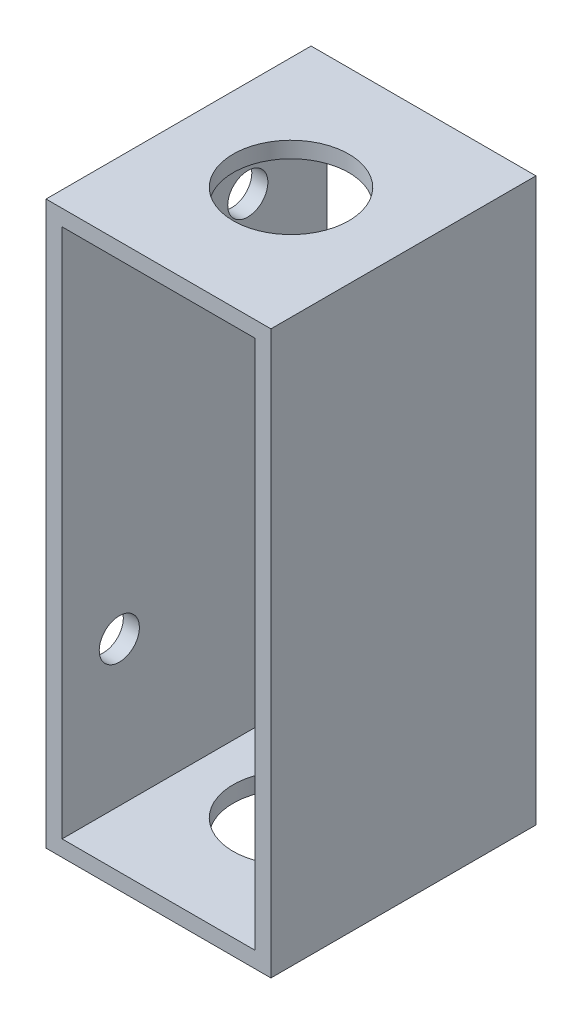
ISO-10303-21;
HEADER;
FILE_DESCRIPTION(('STEP AP214'),'2;1');
FILE_NAME('part.step','',(''),(''),'','','');
FILE_SCHEMA(('AUTOMOTIVE_DESIGN { 1 0 10303 214 1 1 1 1 }'));
ENDSEC;
DATA;
#1=APPLICATION_CONTEXT('core data for automotive mechanical design processes');
#2=APPLICATION_PROTOCOL_DEFINITION('international standard','automotive_design',2000,#1);
#3=PRODUCT_CONTEXT('',#1,'mechanical');
#4=PRODUCT('Part','Part','',(#3));
#5=PRODUCT_RELATED_PRODUCT_CATEGORY('part','',(#4));
#6=PRODUCT_DEFINITION_FORMATION('','',#4);
#7=PRODUCT_DEFINITION_CONTEXT('part definition',#1,'design');
#8=PRODUCT_DEFINITION('design','',#6,#7);
#9=PRODUCT_DEFINITION_SHAPE('','',#8);
#10=(LENGTH_UNIT() NAMED_UNIT(*) SI_UNIT(.MILLI.,.METRE.));
#11=(NAMED_UNIT(*) PLANE_ANGLE_UNIT() SI_UNIT($,.RADIAN.));
#12=(NAMED_UNIT(*) SI_UNIT($,.STERADIAN.) SOLID_ANGLE_UNIT());
#13=UNCERTAINTY_MEASURE_WITH_UNIT(LENGTH_MEASURE(1.E-05),#10,'distance_accuracy_value','');
#14=(GEOMETRIC_REPRESENTATION_CONTEXT(3) GLOBAL_UNCERTAINTY_ASSIGNED_CONTEXT((#13)) GLOBAL_UNIT_ASSIGNED_CONTEXT((#10,
#11,#12)) REPRESENTATION_CONTEXT('',''));
#15=CARTESIAN_POINT('',(0.,0.,0.));
#16=DIRECTION('',(0.,0.,1.));
#17=DIRECTION('',(1.,0.,0.));
#18=AXIS2_PLACEMENT_3D('',#15,#16,#17);
#19=CARTESIAN_POINT('',(0.,-5.,16.5));
#20=DIRECTION('',(1.,0.,0.));
#21=DIRECTION('',(0.,1.,0.));
#22=AXIS2_PLACEMENT_3D('',#19,#20,#21);
#23=PLANE('',#22);
#24=CARTESIAN_POINT('',(0.,25.,4.93966677797175));
#25=DIRECTION('',(1.,0.,0.));
#26=DIRECTION('',(0.,0.,-1.));
#27=AXIS2_PLACEMENT_3D('',#24,#25,#26);
#28=CIRCLE('',#27,1.25);
#29=CARTESIAN_POINT('',(0.,25.,3.68966677797175));
#30=VERTEX_POINT('',#29);
#31=EDGE_CURVE('E222',#30,#30,#28,.T.);
#32=ORIENTED_EDGE('',*,*,#31,.T.);
#33=EDGE_LOOP('',(#32));
#34=FACE_BOUND('',#33,.T.);
#35=CARTESIAN_POINT('',(0.,5.,12.9396667779718));
#36=DIRECTION('',(1.,0.,0.));
#37=DIRECTION('',(0.,0.,-1.));
#38=AXIS2_PLACEMENT_3D('',#35,#36,#37);
#39=CIRCLE('',#38,1.25);
#40=CARTESIAN_POINT('',(0.,5.,11.6896667779718));
#41=VERTEX_POINT('',#40);
#42=EDGE_CURVE('E218',#41,#41,#39,.T.);
#43=ORIENTED_EDGE('',*,*,#42,.T.);
#44=EDGE_LOOP('',(#43));
#45=FACE_BOUND('',#44,.T.);
#46=DIRECTION('',(0.,-1.,0.));
#47=VECTOR('',#46,1.);
#48=CARTESIAN_POINT('',(0.,-5.,0.));
#49=LINE('',#48,#47);
#50=CARTESIAN_POINT('',(0.,30.,0.));
#51=VERTEX_POINT('',#50);
#52=CARTESIAN_POINT('',(0.,-5.,0.));
#53=VERTEX_POINT('',#52);
#54=EDGE_CURVE('E142',#51,#53,#49,.T.);
#55=ORIENTED_EDGE('',*,*,#54,.T.);
#56=DIRECTION('',(0.,0.,-1.));
#57=VECTOR('',#56,1.);
#58=CARTESIAN_POINT('',(0.,-5.,16.5));
#59=LINE('',#58,#57);
#60=CARTESIAN_POINT('',(0.,-5.,16.5));
#61=VERTEX_POINT('',#60);
#62=EDGE_CURVE('E184',#61,#53,#59,.T.);
#63=ORIENTED_EDGE('',*,*,#62,.F.);
#64=DIRECTION('',(0.,-1.,0.));
#65=VECTOR('',#64,1.);
#66=CARTESIAN_POINT('',(0.,-5.,16.5));
#67=LINE('',#66,#65);
#68=CARTESIAN_POINT('',(0.,30.,16.5));
#69=VERTEX_POINT('',#68);
#70=EDGE_CURVE('E147',#69,#61,#67,.T.);
#71=ORIENTED_EDGE('',*,*,#70,.F.);
#72=DIRECTION('',(0.,0.,-1.));
#73=VECTOR('',#72,1.);
#74=CARTESIAN_POINT('',(0.,30.,16.5));
#75=LINE('',#74,#73);
#76=EDGE_CURVE('E161',#69,#51,#75,.T.);
#77=ORIENTED_EDGE('',*,*,#76,.T.);
#78=EDGE_LOOP('',(#55,#63,#71,#77));
#79=FACE_BOUND('',#78,.T.);
#80=ADVANCED_FACE('F46',(#34,#45,#79),#23,.F.);
#81=CARTESIAN_POINT('',(0.,-5.,16.5));
#82=DIRECTION('',(0.,1.,0.));
#83=DIRECTION('',(0.,0.,1.));
#84=AXIS2_PLACEMENT_3D('',#81,#82,#83);
#85=PLANE('',#84);
#86=CARTESIAN_POINT('',(7.,-5.,8.25));
#87=DIRECTION('',(0.,1.,0.));
#88=DIRECTION('',(0.,0.,1.));
#89=AXIS2_PLACEMENT_3D('',#86,#87,#88);
#90=CIRCLE('',#89,3.6);
#91=CARTESIAN_POINT('',(7.,-5.,11.85));
#92=VERTEX_POINT('',#91);
#93=EDGE_CURVE('E204',#92,#92,#90,.F.);
#94=ORIENTED_EDGE('',*,*,#93,.F.);
#95=EDGE_LOOP('',(#94));
#96=FACE_BOUND('',#95,.T.);
#97=DIRECTION('',(1.,0.,0.));
#98=VECTOR('',#97,1.);
#99=CARTESIAN_POINT('',(0.,-5.,0.));
#100=LINE('',#99,#98);
#101=CARTESIAN_POINT('',(14.,-5.,0.));
#102=VERTEX_POINT('',#101);
#103=EDGE_CURVE('E165',#53,#102,#100,.T.);
#104=ORIENTED_EDGE('',*,*,#103,.T.);
#105=DIRECTION('',(0.,0.,-1.));
#106=VECTOR('',#105,1.);
#107=CARTESIAN_POINT('',(14.,-5.,16.5));
#108=LINE('',#107,#106);
#109=CARTESIAN_POINT('',(14.,-5.,16.5));
#110=VERTEX_POINT('',#109);
#111=EDGE_CURVE('E180',#110,#102,#108,.T.);
#112=ORIENTED_EDGE('',*,*,#111,.F.);
#113=DIRECTION('',(1.,0.,0.));
#114=VECTOR('',#113,1.);
#115=CARTESIAN_POINT('',(0.,-5.,16.5));
#116=LINE('',#115,#114);
#117=EDGE_CURVE('E151',#61,#110,#116,.T.);
#118=ORIENTED_EDGE('',*,*,#117,.F.);
#119=ORIENTED_EDGE('',*,*,#62,.T.);
#120=EDGE_LOOP('',(#104,#112,#118,#119));
#121=FACE_BOUND('',#120,.T.);
#122=ADVANCED_FACE('F249',(#96,#121),#85,.F.);
#123=CARTESIAN_POINT('',(14.,-5.,16.5));
#124=DIRECTION('',(-1.,0.,0.));
#125=DIRECTION('',(0.,0.,1.));
#126=AXIS2_PLACEMENT_3D('',#123,#124,#125);
#127=PLANE('',#126);
#128=DIRECTION('',(0.,1.,0.));
#129=VECTOR('',#128,1.);
#130=CARTESIAN_POINT('',(14.,-5.,0.));
#131=LINE('',#130,#129);
#132=CARTESIAN_POINT('',(14.,30.,0.));
#133=VERTEX_POINT('',#132);
#134=EDGE_CURVE('E168',#102,#133,#131,.T.);
#135=ORIENTED_EDGE('',*,*,#134,.T.);
#136=DIRECTION('',(0.,0.,-1.));
#137=VECTOR('',#136,1.);
#138=CARTESIAN_POINT('',(14.,30.,16.5));
#139=LINE('',#138,#137);
#140=CARTESIAN_POINT('',(14.,30.,16.5));
#141=VERTEX_POINT('',#140);
#142=EDGE_CURVE('E176',#141,#133,#139,.T.);
#143=ORIENTED_EDGE('',*,*,#142,.F.);
#144=DIRECTION('',(0.,1.,0.));
#145=VECTOR('',#144,1.);
#146=CARTESIAN_POINT('',(14.,-5.,16.5));
#147=LINE('',#146,#145);
#148=EDGE_CURVE('E155',#110,#141,#147,.T.);
#149=ORIENTED_EDGE('',*,*,#148,.F.);
#150=ORIENTED_EDGE('',*,*,#111,.T.);
#151=EDGE_LOOP('',(#135,#143,#149,#150));
#152=FACE_BOUND('',#151,.T.);
#153=ADVANCED_FACE('F255',(#152),#127,.F.);
#154=CARTESIAN_POINT('',(0.,30.,16.5));
#155=DIRECTION('',(0.,-1.,0.));
#156=DIRECTION('',(0.,0.,-1.));
#157=AXIS2_PLACEMENT_3D('',#154,#155,#156);
#158=PLANE('',#157);
#159=CARTESIAN_POINT('',(7.,30.,8.25));
#160=DIRECTION('',(0.,1.,0.));
#161=DIRECTION('',(0.,0.,1.));
#162=AXIS2_PLACEMENT_3D('',#159,#160,#161);
#163=CIRCLE('',#162,3.6);
#164=CARTESIAN_POINT('',(7.,30.,11.85));
#165=VERTEX_POINT('',#164);
#166=EDGE_CURVE('E213',#165,#165,#163,.T.);
#167=ORIENTED_EDGE('',*,*,#166,.F.);
#168=EDGE_LOOP('',(#167));
#169=FACE_BOUND('',#168,.T.);
#170=DIRECTION('',(-1.,0.,0.));
#171=VECTOR('',#170,1.);
#172=CARTESIAN_POINT('',(0.,30.,0.));
#173=LINE('',#172,#171);
#174=EDGE_CURVE('E152',#133,#51,#173,.T.);
#175=ORIENTED_EDGE('',*,*,#174,.T.);
#176=ORIENTED_EDGE('',*,*,#76,.F.);
#177=DIRECTION('',(-1.,0.,0.));
#178=VECTOR('',#177,1.);
#179=CARTESIAN_POINT('',(0.,30.,16.5));
#180=LINE('',#179,#178);
#181=EDGE_CURVE('E158',#141,#69,#180,.T.);
#182=ORIENTED_EDGE('',*,*,#181,.F.);
#183=ORIENTED_EDGE('',*,*,#142,.T.);
#184=EDGE_LOOP('',(#175,#176,#182,#183));
#185=FACE_BOUND('',#184,.T.);
#186=ADVANCED_FACE('F262',(#169,#185),#158,.F.);
#187=CARTESIAN_POINT('',(0.,0.,16.5));
#188=DIRECTION('',(0.,0.,-1.));
#189=DIRECTION('',(-1.,0.,0.));
#190=AXIS2_PLACEMENT_3D('',#187,#188,#189);
#191=PLANE('',#190);
#192=DIRECTION('',(1.,0.,0.));
#193=VECTOR('',#192,1.);
#194=CARTESIAN_POINT('',(1.,-4.,16.5));
#195=LINE('',#194,#193);
#196=CARTESIAN_POINT('',(1.,-4.,16.5));
#197=VERTEX_POINT('',#196);
#198=CARTESIAN_POINT('',(13.,-4.,16.5));
#199=VERTEX_POINT('',#198);
#200=EDGE_CURVE('E124',#197,#199,#195,.T.);
#201=ORIENTED_EDGE('',*,*,#200,.F.);
#202=DIRECTION('',(0.,-1.,0.));
#203=VECTOR('',#202,1.);
#204=CARTESIAN_POINT('',(1.,29.,16.5));
#205=LINE('',#204,#203);
#206=CARTESIAN_POINT('',(1.,29.,16.5));
#207=VERTEX_POINT('',#206);
#208=EDGE_CURVE('E62',#207,#197,#205,.T.);
#209=ORIENTED_EDGE('',*,*,#208,.F.);
#210=DIRECTION('',(-1.,0.,0.));
#211=VECTOR('',#210,1.);
#212=CARTESIAN_POINT('',(1.,29.,16.5));
#213=LINE('',#212,#211);
#214=CARTESIAN_POINT('',(13.,29.,16.5));
#215=VERTEX_POINT('',#214);
#216=EDGE_CURVE('E132',#215,#207,#213,.T.);
#217=ORIENTED_EDGE('',*,*,#216,.F.);
#218=DIRECTION('',(0.,1.,0.));
#219=VECTOR('',#218,1.);
#220=CARTESIAN_POINT('',(13.,29.,16.5));
#221=LINE('',#220,#219);
#222=EDGE_CURVE('E114',#199,#215,#221,.T.);
#223=ORIENTED_EDGE('',*,*,#222,.F.);
#224=EDGE_LOOP('',(#201,#209,#217,#223));
#225=FACE_BOUND('',#224,.T.);
#226=ORIENTED_EDGE('',*,*,#70,.T.);
#227=ORIENTED_EDGE('',*,*,#117,.T.);
#228=ORIENTED_EDGE('',*,*,#148,.T.);
#229=ORIENTED_EDGE('',*,*,#181,.T.);
#230=EDGE_LOOP('',(#226,#227,#228,#229));
#231=FACE_BOUND('',#230,.T.);
#232=ADVANCED_FACE('F129',(#225,#231),#191,.F.);
#233=CARTESIAN_POINT('',(0.,0.,0.));
#234=DIRECTION('',(0.,0.,-1.));
#235=DIRECTION('',(-1.,0.,0.));
#236=AXIS2_PLACEMENT_3D('',#233,#234,#235);
#237=PLANE('',#236);
#238=DIRECTION('',(0.,1.,0.));
#239=VECTOR('',#238,1.);
#240=CARTESIAN_POINT('',(1.,0.,0.));
#241=LINE('',#240,#239);
#242=CARTESIAN_POINT('',(1.,-4.,0.));
#243=VERTEX_POINT('',#242);
#244=CARTESIAN_POINT('',(1.,29.,0.));
#245=VERTEX_POINT('',#244);
#246=EDGE_CURVE('E12',#243,#245,#241,.T.);
#247=ORIENTED_EDGE('',*,*,#246,.F.);
#248=DIRECTION('',(-1.,0.,0.));
#249=VECTOR('',#248,1.);
#250=CARTESIAN_POINT('',(0.,-4.,0.));
#251=LINE('',#250,#249);
#252=CARTESIAN_POINT('',(13.,-4.,0.));
#253=VERTEX_POINT('',#252);
#254=EDGE_CURVE('E188',#253,#243,#251,.T.);
#255=ORIENTED_EDGE('',*,*,#254,.F.);
#256=DIRECTION('',(0.,-1.,0.));
#257=VECTOR('',#256,1.);
#258=CARTESIAN_POINT('',(13.,0.,0.));
#259=LINE('',#258,#257);
#260=CARTESIAN_POINT('',(13.,29.,0.));
#261=VERTEX_POINT('',#260);
#262=EDGE_CURVE('E117',#261,#253,#259,.T.);
#263=ORIENTED_EDGE('',*,*,#262,.F.);
#264=DIRECTION('',(1.,0.,0.));
#265=VECTOR('',#264,1.);
#266=CARTESIAN_POINT('',(0.,29.,0.));
#267=LINE('',#266,#265);
#268=EDGE_CURVE('E55',#245,#261,#267,.T.);
#269=ORIENTED_EDGE('',*,*,#268,.F.);
#270=EDGE_LOOP('',(#247,#255,#263,#269));
#271=FACE_BOUND('',#270,.T.);
#272=ORIENTED_EDGE('',*,*,#54,.F.);
#273=ORIENTED_EDGE('',*,*,#174,.F.);
#274=ORIENTED_EDGE('',*,*,#134,.F.);
#275=ORIENTED_EDGE('',*,*,#103,.F.);
#276=EDGE_LOOP('',(#272,#273,#274,#275));
#277=FACE_BOUND('',#276,.T.);
#278=ADVANCED_FACE('F200',(#271,#277),#237,.T.);
#279=CARTESIAN_POINT('',(1.,29.,-1.2E-05));
#280=DIRECTION('',(-1.,0.,0.));
#281=DIRECTION('',(0.,-1.,0.));
#282=AXIS2_PLACEMENT_3D('',#279,#280,#281);
#283=PLANE('',#282);
#284=CARTESIAN_POINT('',(1.,25.,4.93966677797175));
#285=DIRECTION('',(-1.,0.,0.));
#286=DIRECTION('',(0.,-1.,0.));
#287=AXIS2_PLACEMENT_3D('',#284,#285,#286);
#288=CIRCLE('',#287,1.25);
#289=CARTESIAN_POINT('',(1.,23.75,4.93966677797175));
#290=VERTEX_POINT('',#289);
#291=EDGE_CURVE('E217',#290,#290,#288,.T.);
#292=ORIENTED_EDGE('',*,*,#291,.T.);
#293=EDGE_LOOP('',(#292));
#294=FACE_BOUND('',#293,.T.);
#295=CARTESIAN_POINT('',(1.,5.,12.9396667779718));
#296=DIRECTION('',(-1.,0.,0.));
#297=DIRECTION('',(0.,-1.,0.));
#298=AXIS2_PLACEMENT_3D('',#295,#296,#297);
#299=CIRCLE('',#298,1.25);
#300=CARTESIAN_POINT('',(1.,3.75,12.9396667779718));
#301=VERTEX_POINT('',#300);
#302=EDGE_CURVE('E223',#301,#301,#299,.T.);
#303=ORIENTED_EDGE('',*,*,#302,.T.);
#304=EDGE_LOOP('',(#303));
#305=FACE_BOUND('',#304,.T.);
#306=ORIENTED_EDGE('',*,*,#246,.T.);
#307=DIRECTION('',(0.,0.,1.));
#308=VECTOR('',#307,1.);
#309=CARTESIAN_POINT('',(1.,29.,-1.2E-05));
#310=LINE('',#309,#308);
#311=EDGE_CURVE('E139',#245,#207,#310,.T.);
#312=ORIENTED_EDGE('',*,*,#311,.T.);
#313=ORIENTED_EDGE('',*,*,#208,.T.);
#314=DIRECTION('',(0.,0.,1.));
#315=VECTOR('',#314,1.);
#316=CARTESIAN_POINT('',(1.,-4.,-1.2E-05));
#317=LINE('',#316,#315);
#318=EDGE_CURVE('E121',#243,#197,#317,.T.);
#319=ORIENTED_EDGE('',*,*,#318,.F.);
#320=EDGE_LOOP('',(#306,#312,#313,#319));
#321=FACE_BOUND('',#320,.T.);
#322=ADVANCED_FACE('F202',(#294,#305,#321),#283,.F.);
#323=CARTESIAN_POINT('',(1.,29.,-1.2E-05));
#324=DIRECTION('',(0.,1.,0.));
#325=DIRECTION('',(0.,0.,1.));
#326=AXIS2_PLACEMENT_3D('',#323,#324,#325);
#327=PLANE('',#326);
#328=CARTESIAN_POINT('',(7.,29.,8.25));
#329=DIRECTION('',(0.,1.,0.));
#330=DIRECTION('',(0.,0.,1.));
#331=AXIS2_PLACEMENT_3D('',#328,#329,#330);
#332=CIRCLE('',#331,3.6);
#333=CARTESIAN_POINT('',(7.,29.,11.85));
#334=VERTEX_POINT('',#333);
#335=EDGE_CURVE('E207',#334,#334,#332,.F.);
#336=ORIENTED_EDGE('',*,*,#335,.F.);
#337=EDGE_LOOP('',(#336));
#338=FACE_BOUND('',#337,.T.);
#339=ORIENTED_EDGE('',*,*,#268,.T.);
#340=DIRECTION('',(0.,0.,1.));
#341=VECTOR('',#340,1.);
#342=CARTESIAN_POINT('',(13.,29.,-1.2E-05));
#343=LINE('',#342,#341);
#344=EDGE_CURVE('E120',#261,#215,#343,.T.);
#345=ORIENTED_EDGE('',*,*,#344,.T.);
#346=ORIENTED_EDGE('',*,*,#216,.T.);
#347=ORIENTED_EDGE('',*,*,#311,.F.);
#348=EDGE_LOOP('',(#339,#345,#346,#347));
#349=FACE_BOUND('',#348,.T.);
#350=ADVANCED_FACE('F197',(#338,#349),#327,.F.);
#351=CARTESIAN_POINT('',(13.,29.,-1.2E-05));
#352=DIRECTION('',(1.,0.,0.));
#353=DIRECTION('',(0.,1.,0.));
#354=AXIS2_PLACEMENT_3D('',#351,#352,#353);
#355=PLANE('',#354);
#356=ORIENTED_EDGE('',*,*,#262,.T.);
#357=DIRECTION('',(0.,0.,1.));
#358=VECTOR('',#357,1.);
#359=CARTESIAN_POINT('',(13.,-4.,-1.2E-05));
#360=LINE('',#359,#358);
#361=EDGE_CURVE('E70',#253,#199,#360,.T.);
#362=ORIENTED_EDGE('',*,*,#361,.T.);
#363=ORIENTED_EDGE('',*,*,#222,.T.);
#364=ORIENTED_EDGE('',*,*,#344,.F.);
#365=EDGE_LOOP('',(#356,#362,#363,#364));
#366=FACE_BOUND('',#365,.T.);
#367=ADVANCED_FACE('F111',(#366),#355,.F.);
#368=CARTESIAN_POINT('',(1.,-4.,-1.2E-05));
#369=DIRECTION('',(0.,-1.,0.));
#370=DIRECTION('',(1.,0.,0.));
#371=AXIS2_PLACEMENT_3D('',#368,#369,#370);
#372=PLANE('',#371);
#373=CARTESIAN_POINT('',(7.,-4.,8.25));
#374=DIRECTION('',(0.,-1.,0.));
#375=DIRECTION('',(1.,0.,0.));
#376=AXIS2_PLACEMENT_3D('',#373,#374,#375);
#377=CIRCLE('',#376,3.6);
#378=CARTESIAN_POINT('',(10.6,-4.,8.25));
#379=VERTEX_POINT('',#378);
#380=EDGE_CURVE('E49',#379,#379,#377,.F.);
#381=ORIENTED_EDGE('',*,*,#380,.F.);
#382=EDGE_LOOP('',(#381));
#383=FACE_BOUND('',#382,.T.);
#384=ORIENTED_EDGE('',*,*,#254,.T.);
#385=ORIENTED_EDGE('',*,*,#318,.T.);
#386=ORIENTED_EDGE('',*,*,#200,.T.);
#387=ORIENTED_EDGE('',*,*,#361,.F.);
#388=EDGE_LOOP('',(#384,#385,#386,#387));
#389=FACE_BOUND('',#388,.T.);
#390=ADVANCED_FACE('F125',(#383,#389),#372,.F.);
#391=CARTESIAN_POINT('',(7.,30.,8.25));
#392=DIRECTION('',(0.,-1.,0.));
#393=DIRECTION('',(0.,0.,-1.));
#394=AXIS2_PLACEMENT_3D('',#391,#392,#393);
#395=CYLINDRICAL_SURFACE('',#394,3.6);
#396=ORIENTED_EDGE('',*,*,#380,.T.);
#397=EDGE_LOOP('',(#396));
#398=FACE_BOUND('',#397,.T.);
#399=ORIENTED_EDGE('',*,*,#93,.T.);
#400=EDGE_LOOP('',(#399));
#401=FACE_BOUND('',#400,.T.);
#402=ADVANCED_FACE('F278',(#398,#401),#395,.F.);
#403=ORIENTED_EDGE('',*,*,#166,.T.);
#404=EDGE_LOOP('',(#403));
#405=FACE_BOUND('',#404,.T.);
#406=ORIENTED_EDGE('',*,*,#335,.T.);
#407=EDGE_LOOP('',(#406));
#408=FACE_BOUND('',#407,.T.);
#409=ADVANCED_FACE('F244',(#405,#408),#395,.F.);
#410=CARTESIAN_POINT('',(4.53553390593274,5.,12.9396667779718));
#411=DIRECTION('',(-1.,0.,0.));
#412=DIRECTION('',(0.,-1.,0.));
#413=AXIS2_PLACEMENT_3D('',#410,#411,#412);
#414=CYLINDRICAL_SURFACE('',#413,1.25);
#415=ORIENTED_EDGE('',*,*,#302,.F.);
#416=EDGE_LOOP('',(#415));
#417=FACE_BOUND('',#416,.T.);
#418=ORIENTED_EDGE('',*,*,#42,.F.);
#419=EDGE_LOOP('',(#418));
#420=FACE_BOUND('',#419,.T.);
#421=ADVANCED_FACE('F238',(#417,#420),#414,.F.);
#422=CARTESIAN_POINT('',(4.53553390593274,25.,4.93966677797175));
#423=DIRECTION('',(-1.,0.,0.));
#424=DIRECTION('',(0.,-1.,0.));
#425=AXIS2_PLACEMENT_3D('',#422,#423,#424);
#426=CYLINDRICAL_SURFACE('',#425,1.25);
#427=ORIENTED_EDGE('',*,*,#291,.F.);
#428=EDGE_LOOP('',(#427));
#429=FACE_BOUND('',#428,.T.);
#430=ORIENTED_EDGE('',*,*,#31,.F.);
#431=EDGE_LOOP('',(#430));
#432=FACE_BOUND('',#431,.T.);
#433=ADVANCED_FACE('F236',(#429,#432),#426,.F.);
#434=CLOSED_SHELL('',(#80,#122,#153,#186,#232,#278,#322,#350,#367,#390,#402,#409,#421,#433));
#435=MANIFOLD_SOLID_BREP('B2',#434);
#436=ADVANCED_BREP_SHAPE_REPRESENTATION('',(#18,#435),#14);
#437=SHAPE_DEFINITION_REPRESENTATION(#9,#436);
ENDSEC;
END-ISO-10303-21;
